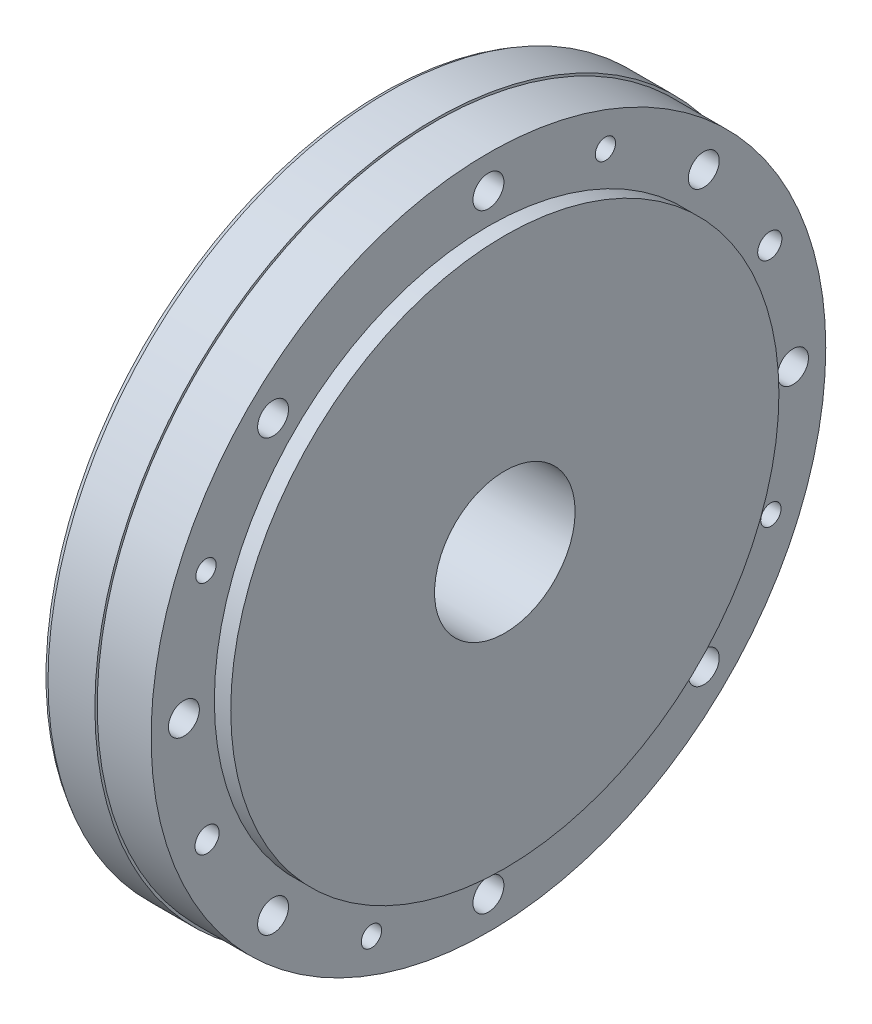
ISO-10303-21;
HEADER;
FILE_DESCRIPTION(('STEP AP214'),'2;1');
FILE_NAME('part.step','',(''),(''),'','','');
FILE_SCHEMA(('AUTOMOTIVE_DESIGN { 1 0 10303 214 1 1 1 1 }'));
ENDSEC;
DATA;
#1=APPLICATION_CONTEXT('core data for automotive mechanical design processes');
#2=APPLICATION_PROTOCOL_DEFINITION('international standard','automotive_design',2000,#1);
#3=PRODUCT_CONTEXT('',#1,'mechanical');
#4=PRODUCT('Part','Part','',(#3));
#5=PRODUCT_RELATED_PRODUCT_CATEGORY('part','',(#4));
#6=PRODUCT_DEFINITION_FORMATION('','',#4);
#7=PRODUCT_DEFINITION_CONTEXT('part definition',#1,'design');
#8=PRODUCT_DEFINITION('design','',#6,#7);
#9=PRODUCT_DEFINITION_SHAPE('','',#8);
#10=(LENGTH_UNIT() NAMED_UNIT(*) SI_UNIT(.MILLI.,.METRE.));
#11=(NAMED_UNIT(*) PLANE_ANGLE_UNIT() SI_UNIT($,.RADIAN.));
#12=(NAMED_UNIT(*) SI_UNIT($,.STERADIAN.) SOLID_ANGLE_UNIT());
#13=UNCERTAINTY_MEASURE_WITH_UNIT(LENGTH_MEASURE(1.E-05),#10,'distance_accuracy_value','');
#14=(GEOMETRIC_REPRESENTATION_CONTEXT(3) GLOBAL_UNCERTAINTY_ASSIGNED_CONTEXT((#13)) GLOBAL_UNIT_ASSIGNED_CONTEXT((#10,
#11,#12)) REPRESENTATION_CONTEXT('',''));
#15=CARTESIAN_POINT('',(0.,0.,0.));
#16=DIRECTION('',(0.,0.,1.));
#17=DIRECTION('',(1.,0.,0.));
#18=AXIS2_PLACEMENT_3D('',#15,#16,#17);
#19=CARTESIAN_POINT('',(-9.9999999998273,-15.,0.));
#20=DIRECTION('',(1.,0.,0.));
#21=DIRECTION('',(0.,0.,-1.));
#22=AXIS2_PLACEMENT_3D('',#19,#20,#21);
#23=CONICAL_SURFACE('',#22,72.4999999997008,0.523598775000002);
#24=CARTESIAN_POINT('',(-9.99999999982729,-15.,0.));
#25=DIRECTION('',(1.,0.,0.));
#26=DIRECTION('',(0.,0.,-1.));
#27=AXIS2_PLACEMENT_3D('',#24,#25,#26);
#28=CIRCLE('',#27,72.5);
#29=CARTESIAN_POINT('',(-9.99999999982729,-15.,-72.5));
#30=VERTEX_POINT('',#29);
#31=EDGE_CURVE('E31',#30,#30,#28,.T.);
#32=ORIENTED_EDGE('',*,*,#31,.F.);
#33=EDGE_LOOP('',(#32));
#34=FACE_BOUND('',#33,.T.);
#35=CARTESIAN_POINT('',(-11.0000000001727,-15.,0.));
#36=DIRECTION('',(1.,0.,0.));
#37=DIRECTION('',(0.,0.,-1.));
#38=AXIS2_PLACEMENT_3D('',#35,#36,#37);
#39=CIRCLE('',#38,71.9226497311095);
#40=CARTESIAN_POINT('',(-11.0000000001727,-15.,-71.9226497311095));
#41=VERTEX_POINT('',#40);
#42=EDGE_CURVE('E19',#41,#41,#39,.F.);
#43=ORIENTED_EDGE('',*,*,#42,.F.);
#44=EDGE_LOOP('',(#43));
#45=FACE_BOUND('',#44,.T.);
#46=ADVANCED_FACE('F16',(#34,#45),#23,.T.);
#47=CARTESIAN_POINT('',(-5.5,-15.,0.));
#48=DIRECTION('',(1.,0.,0.));
#49=DIRECTION('',(0.,0.,-1.));
#50=AXIS2_PLACEMENT_3D('',#47,#48,#49);
#51=CYLINDRICAL_SURFACE('',#50,72.5);
#52=CARTESIAN_POINT('',(0.,-15.,0.));
#53=DIRECTION('',(1.,0.,0.));
#54=DIRECTION('',(0.,0.,-1.));
#55=AXIS2_PLACEMENT_3D('',#52,#53,#54);
#56=CIRCLE('',#55,72.5);
#57=CARTESIAN_POINT('',(0.,-15.,-72.5));
#58=VERTEX_POINT('',#57);
#59=EDGE_CURVE('E133',#58,#58,#56,.T.);
#60=ORIENTED_EDGE('',*,*,#59,.F.);
#61=EDGE_LOOP('',(#60));
#62=FACE_BOUND('',#61,.T.);
#63=ORIENTED_EDGE('',*,*,#31,.T.);
#64=EDGE_LOOP('',(#63));
#65=FACE_BOUND('',#64,.T.);
#66=ADVANCED_FACE('F143',(#62,#65),#51,.T.);
#67=CARTESIAN_POINT('',(-11.,46.75,0.));
#68=DIRECTION('',(-1.,0.,0.));
#69=DIRECTION('',(0.,0.,1.));
#70=AXIS2_PLACEMENT_3D('',#67,#68,#69);
#71=PLANE('',#70);
#72=ORIENTED_EDGE('',*,*,#42,.T.);
#73=EDGE_LOOP('',(#72));
#74=FACE_BOUND('',#73,.T.);
#75=CARTESIAN_POINT('',(-11.,-39.8744231037308,60.0521696132337));
#76=DIRECTION('',(1.,0.,0.));
#77=DIRECTION('',(0.,0.,-1.));
#78=AXIS2_PLACEMENT_3D('',#75,#76,#77);
#79=CIRCLE('',#78,2.5765);
#80=CARTESIAN_POINT('',(-11.,-39.8744231037308,57.4756696132336));
#81=VERTEX_POINT('',#80);
#82=EDGE_CURVE('E89',#81,#81,#79,.T.);
#83=ORIENTED_EDGE('',*,*,#82,.T.);
#84=EDGE_LOOP('',(#83));
#85=FACE_BOUND('',#84,.T.);
#86=CARTESIAN_POINT('',(-11.,9.87442310373082,-60.0521696132337));
#87=DIRECTION('',(1.,0.,0.));
#88=DIRECTION('',(0.,0.,-1.));
#89=AXIS2_PLACEMENT_3D('',#86,#87,#88);
#90=CIRCLE('',#89,2.5765);
#91=CARTESIAN_POINT('',(-11.,9.87442310373082,-62.6286696132337));
#92=VERTEX_POINT('',#91);
#93=EDGE_CURVE('E92',#92,#92,#90,.T.);
#94=ORIENTED_EDGE('',*,*,#93,.T.);
#95=EDGE_LOOP('',(#94));
#96=FACE_BOUND('',#95,.T.);
#97=CARTESIAN_POINT('',(-11.,-15.,0.));
#98=DIRECTION('',(1.,0.,0.));
#99=DIRECTION('',(0.,0.,-1.));
#100=AXIS2_PLACEMENT_3D('',#97,#98,#99);
#101=CIRCLE('',#100,58.5);
#102=CARTESIAN_POINT('',(-11.,-15.,-58.5));
#103=VERTEX_POINT('',#102);
#104=EDGE_CURVE('E131',#103,#103,#101,.T.);
#105=ORIENTED_EDGE('',*,*,#104,.T.);
#106=EDGE_LOOP('',(#105));
#107=FACE_BOUND('',#106,.T.);
#108=CARTESIAN_POINT('',(-11.,50.,0.));
#109=DIRECTION('',(1.,0.,0.));
#110=DIRECTION('',(0.,0.,-1.));
#111=AXIS2_PLACEMENT_3D('',#108,#109,#110);
#112=CIRCLE('',#111,3.3);
#113=CARTESIAN_POINT('',(-11.,50.,-3.30000000000001));
#114=VERTEX_POINT('',#113);
#115=EDGE_CURVE('E128',#114,#114,#112,.T.);
#116=ORIENTED_EDGE('',*,*,#115,.T.);
#117=EDGE_LOOP('',(#116));
#118=FACE_BOUND('',#117,.T.);
#119=CARTESIAN_POINT('',(-11.,30.9619407771256,45.9619407771256));
#120=DIRECTION('',(1.,0.,0.));
#121=DIRECTION('',(0.,0.,-1.));
#122=AXIS2_PLACEMENT_3D('',#119,#120,#121);
#123=CIRCLE('',#122,3.3);
#124=CARTESIAN_POINT('',(-11.,30.9619407771256,42.6619407771256));
#125=VERTEX_POINT('',#124);
#126=EDGE_CURVE('E125',#125,#125,#123,.T.);
#127=ORIENTED_EDGE('',*,*,#126,.T.);
#128=EDGE_LOOP('',(#127));
#129=FACE_BOUND('',#128,.T.);
#130=CARTESIAN_POINT('',(-11.,-15.,65.));
#131=DIRECTION('',(1.,0.,0.));
#132=DIRECTION('',(0.,0.,-1.));
#133=AXIS2_PLACEMENT_3D('',#130,#131,#132);
#134=CIRCLE('',#133,3.3);
#135=CARTESIAN_POINT('',(-11.,-15.,61.7));
#136=VERTEX_POINT('',#135);
#137=EDGE_CURVE('E122',#136,#136,#134,.T.);
#138=ORIENTED_EDGE('',*,*,#137,.T.);
#139=EDGE_LOOP('',(#138));
#140=FACE_BOUND('',#139,.T.);
#141=CARTESIAN_POINT('',(-11.,-60.9619407771256,45.9619407771256));
#142=DIRECTION('',(1.,0.,0.));
#143=DIRECTION('',(0.,0.,-1.));
#144=AXIS2_PLACEMENT_3D('',#141,#142,#143);
#145=CIRCLE('',#144,3.3);
#146=CARTESIAN_POINT('',(-11.,-60.9619407771256,42.6619407771256));
#147=VERTEX_POINT('',#146);
#148=EDGE_CURVE('E119',#147,#147,#145,.T.);
#149=ORIENTED_EDGE('',*,*,#148,.T.);
#150=EDGE_LOOP('',(#149));
#151=FACE_BOUND('',#150,.T.);
#152=CARTESIAN_POINT('',(-11.,-80.,0.));
#153=DIRECTION('',(1.,0.,0.));
#154=DIRECTION('',(0.,0.,-1.));
#155=AXIS2_PLACEMENT_3D('',#152,#153,#154);
#156=CIRCLE('',#155,3.3);
#157=CARTESIAN_POINT('',(-11.,-80.,-3.29999999999998));
#158=VERTEX_POINT('',#157);
#159=EDGE_CURVE('E116',#158,#158,#156,.T.);
#160=ORIENTED_EDGE('',*,*,#159,.T.);
#161=EDGE_LOOP('',(#160));
#162=FACE_BOUND('',#161,.T.);
#163=CARTESIAN_POINT('',(-11.,-60.9619407771256,-45.9619407771256));
#164=DIRECTION('',(1.,0.,0.));
#165=DIRECTION('',(0.,0.,-1.));
#166=AXIS2_PLACEMENT_3D('',#163,#164,#165);
#167=CIRCLE('',#166,3.3);
#168=CARTESIAN_POINT('',(-11.,-60.9619407771256,-49.2619407771256));
#169=VERTEX_POINT('',#168);
#170=EDGE_CURVE('E113',#169,#169,#167,.T.);
#171=ORIENTED_EDGE('',*,*,#170,.T.);
#172=EDGE_LOOP('',(#171));
#173=FACE_BOUND('',#172,.T.);
#174=CARTESIAN_POINT('',(-11.,-15.,-65.));
#175=DIRECTION('',(1.,0.,0.));
#176=DIRECTION('',(0.,0.,-1.));
#177=AXIS2_PLACEMENT_3D('',#174,#175,#176);
#178=CIRCLE('',#177,3.3);
#179=CARTESIAN_POINT('',(-11.,-15.,-68.3));
#180=VERTEX_POINT('',#179);
#181=EDGE_CURVE('E110',#180,#180,#178,.T.);
#182=ORIENTED_EDGE('',*,*,#181,.T.);
#183=EDGE_LOOP('',(#182));
#184=FACE_BOUND('',#183,.T.);
#185=CARTESIAN_POINT('',(-11.,30.9619407771256,-45.9619407771256));
#186=DIRECTION('',(1.,0.,0.));
#187=DIRECTION('',(0.,0.,-1.));
#188=AXIS2_PLACEMENT_3D('',#185,#186,#187);
#189=CIRCLE('',#188,3.3);
#190=CARTESIAN_POINT('',(-11.,30.9619407771256,-49.2619407771256));
#191=VERTEX_POINT('',#190);
#192=EDGE_CURVE('E107',#191,#191,#189,.T.);
#193=ORIENTED_EDGE('',*,*,#192,.T.);
#194=EDGE_LOOP('',(#193));
#195=FACE_BOUND('',#194,.T.);
#196=CARTESIAN_POINT('',(-11.,45.2831394963615,-24.9700939618221));
#197=DIRECTION('',(-1.,0.,0.));
#198=DIRECTION('',(0.,0.,1.));
#199=AXIS2_PLACEMENT_3D('',#196,#197,#198);
#200=CIRCLE('',#199,2.167);
#201=CARTESIAN_POINT('',(-11.,45.2831394963615,-22.8030939618221));
#202=VERTEX_POINT('',#201);
#203=EDGE_CURVE('E104',#202,#202,#200,.F.);
#204=ORIENTED_EDGE('',*,*,#203,.T.);
#205=EDGE_LOOP('',(#204));
#206=FACE_BOUND('',#205,.T.);
#207=CARTESIAN_POINT('',(-11.,9.97009396182213,60.2831394963614));
#208=DIRECTION('',(-1.,0.,0.));
#209=DIRECTION('',(0.,0.,1.));
#210=AXIS2_PLACEMENT_3D('',#207,#208,#209);
#211=CIRCLE('',#210,2.167);
#212=CARTESIAN_POINT('',(-11.,9.97009396182213,62.4501394963615));
#213=VERTEX_POINT('',#212);
#214=EDGE_CURVE('E101',#213,#213,#211,.F.);
#215=ORIENTED_EDGE('',*,*,#214,.T.);
#216=EDGE_LOOP('',(#215));
#217=FACE_BOUND('',#216,.T.);
#218=CARTESIAN_POINT('',(-11.,-75.2831394963615,24.9700939618221));
#219=DIRECTION('',(-1.,0.,0.));
#220=DIRECTION('',(0.,0.,1.));
#221=AXIS2_PLACEMENT_3D('',#218,#219,#220);
#222=CIRCLE('',#221,2.167);
#223=CARTESIAN_POINT('',(-11.,-75.2831394963615,27.1370939618221));
#224=VERTEX_POINT('',#223);
#225=EDGE_CURVE('E98',#224,#224,#222,.F.);
#226=ORIENTED_EDGE('',*,*,#225,.T.);
#227=EDGE_LOOP('',(#226));
#228=FACE_BOUND('',#227,.T.);
#229=CARTESIAN_POINT('',(-11.,-39.9700939618221,-60.2831394963614));
#230=DIRECTION('',(-1.,0.,0.));
#231=DIRECTION('',(0.,0.,1.));
#232=AXIS2_PLACEMENT_3D('',#229,#230,#231);
#233=CIRCLE('',#232,2.167);
#234=CARTESIAN_POINT('',(-11.,-39.9700939618221,-58.1161394963614));
#235=VERTEX_POINT('',#234);
#236=EDGE_CURVE('E95',#235,#235,#233,.F.);
#237=ORIENTED_EDGE('',*,*,#236,.T.);
#238=EDGE_LOOP('',(#237));
#239=FACE_BOUND('',#238,.T.);
#240=ADVANCED_FACE('F150',(#74,#85,#96,#107,#118,#129,#140,#151,#162,#173,#184,#195,#206,#217,
#228,#239),#71,.T.);
#241=CARTESIAN_POINT('',(0.,57.25,0.));
#242=DIRECTION('',(1.,0.,0.));
#243=DIRECTION('',(0.,0.,-1.));
#244=AXIS2_PLACEMENT_3D('',#241,#242,#243);
#245=PLANE('',#244);
#246=ORIENTED_EDGE('',*,*,#59,.T.);
#247=EDGE_LOOP('',(#246));
#248=FACE_BOUND('',#247,.T.);
#249=CARTESIAN_POINT('',(0.,-15.,0.));
#250=DIRECTION('',(1.,0.,0.));
#251=DIRECTION('',(0.,0.,-1.));
#252=AXIS2_PLACEMENT_3D('',#249,#250,#251);
#253=CIRCLE('',#252,72.);
#254=CARTESIAN_POINT('',(0.,-15.,-72.));
#255=VERTEX_POINT('',#254);
#256=EDGE_CURVE('E86',#255,#255,#253,.T.);
#257=ORIENTED_EDGE('',*,*,#256,.F.);
#258=EDGE_LOOP('',(#257));
#259=FACE_BOUND('',#258,.T.);
#260=ADVANCED_FACE('F238',(#248,#259),#245,.T.);
#261=CARTESIAN_POINT('',(-9.5,-15.,0.));
#262=DIRECTION('',(1.,0.,0.));
#263=DIRECTION('',(0.,0.,-1.));
#264=AXIS2_PLACEMENT_3D('',#261,#262,#263);
#265=CYLINDRICAL_SURFACE('',#264,58.5);
#266=ORIENTED_EDGE('',*,*,#104,.F.);
#267=EDGE_LOOP('',(#266));
#268=FACE_BOUND('',#267,.T.);
#269=CARTESIAN_POINT('',(-8.,-15.,0.));
#270=DIRECTION('',(1.,0.,0.));
#271=DIRECTION('',(0.,0.,-1.));
#272=AXIS2_PLACEMENT_3D('',#269,#270,#271);
#273=CIRCLE('',#272,58.5);
#274=CARTESIAN_POINT('',(-8.,-15.,-58.5));
#275=VERTEX_POINT('',#274);
#276=EDGE_CURVE('E83',#275,#275,#273,.F.);
#277=ORIENTED_EDGE('',*,*,#276,.F.);
#278=EDGE_LOOP('',(#277));
#279=FACE_BOUND('',#278,.T.);
#280=ADVANCED_FACE('F234',(#268,#279),#265,.F.);
#281=CARTESIAN_POINT('',(195.702685033359,50.,0.));
#282=DIRECTION('',(1.,0.,0.));
#283=DIRECTION('',(0.,0.,-1.));
#284=AXIS2_PLACEMENT_3D('',#281,#282,#283);
#285=CYLINDRICAL_SURFACE('',#284,3.3);
#286=ORIENTED_EDGE('',*,*,#115,.F.);
#287=EDGE_LOOP('',(#286));
#288=FACE_BOUND('',#287,.T.);
#289=CARTESIAN_POINT('',(11.5,50.,0.));
#290=DIRECTION('',(1.,0.,0.));
#291=DIRECTION('',(0.,0.,-1.));
#292=AXIS2_PLACEMENT_3D('',#289,#290,#291);
#293=CIRCLE('',#292,3.3);
#294=CARTESIAN_POINT('',(11.5,50.,-3.30000000000001));
#295=VERTEX_POINT('',#294);
#296=EDGE_CURVE('E80',#295,#295,#293,.F.);
#297=ORIENTED_EDGE('',*,*,#296,.F.);
#298=EDGE_LOOP('',(#297));
#299=FACE_BOUND('',#298,.T.);
#300=ADVANCED_FACE('F230',(#288,#299),#285,.F.);
#301=CARTESIAN_POINT('',(195.702685033359,30.9619407771256,45.9619407771256));
#302=DIRECTION('',(1.,0.,0.));
#303=DIRECTION('',(0.,0.,-1.));
#304=AXIS2_PLACEMENT_3D('',#301,#302,#303);
#305=CYLINDRICAL_SURFACE('',#304,3.3);
#306=ORIENTED_EDGE('',*,*,#126,.F.);
#307=EDGE_LOOP('',(#306));
#308=FACE_BOUND('',#307,.T.);
#309=CARTESIAN_POINT('',(11.5,30.9619407771256,45.9619407771256));
#310=DIRECTION('',(1.,0.,0.));
#311=DIRECTION('',(0.,0.,-1.));
#312=AXIS2_PLACEMENT_3D('',#309,#310,#311);
#313=CIRCLE('',#312,3.3);
#314=CARTESIAN_POINT('',(11.5,30.9619407771256,42.6619407771256));
#315=VERTEX_POINT('',#314);
#316=EDGE_CURVE('E77',#315,#315,#313,.F.);
#317=ORIENTED_EDGE('',*,*,#316,.F.);
#318=EDGE_LOOP('',(#317));
#319=FACE_BOUND('',#318,.T.);
#320=ADVANCED_FACE('F226',(#308,#319),#305,.F.);
#321=CARTESIAN_POINT('',(195.702685033359,-15.,65.));
#322=DIRECTION('',(1.,0.,0.));
#323=DIRECTION('',(0.,0.,-1.));
#324=AXIS2_PLACEMENT_3D('',#321,#322,#323);
#325=CYLINDRICAL_SURFACE('',#324,3.3);
#326=ORIENTED_EDGE('',*,*,#137,.F.);
#327=EDGE_LOOP('',(#326));
#328=FACE_BOUND('',#327,.T.);
#329=CARTESIAN_POINT('',(11.5,-15.,65.));
#330=DIRECTION('',(1.,0.,0.));
#331=DIRECTION('',(0.,0.,-1.));
#332=AXIS2_PLACEMENT_3D('',#329,#330,#331);
#333=CIRCLE('',#332,3.3);
#334=CARTESIAN_POINT('',(11.5,-15.,61.7));
#335=VERTEX_POINT('',#334);
#336=EDGE_CURVE('E74',#335,#335,#333,.F.);
#337=ORIENTED_EDGE('',*,*,#336,.F.);
#338=EDGE_LOOP('',(#337));
#339=FACE_BOUND('',#338,.T.);
#340=ADVANCED_FACE('F222',(#328,#339),#325,.F.);
#341=CARTESIAN_POINT('',(195.702685033359,-60.9619407771256,45.9619407771256));
#342=DIRECTION('',(1.,0.,0.));
#343=DIRECTION('',(0.,0.,-1.));
#344=AXIS2_PLACEMENT_3D('',#341,#342,#343);
#345=CYLINDRICAL_SURFACE('',#344,3.3);
#346=ORIENTED_EDGE('',*,*,#148,.F.);
#347=EDGE_LOOP('',(#346));
#348=FACE_BOUND('',#347,.T.);
#349=CARTESIAN_POINT('',(11.5,-60.9619407771256,45.9619407771256));
#350=DIRECTION('',(1.,0.,0.));
#351=DIRECTION('',(0.,0.,-1.));
#352=AXIS2_PLACEMENT_3D('',#349,#350,#351);
#353=CIRCLE('',#352,3.3);
#354=CARTESIAN_POINT('',(11.5,-60.9619407771256,42.6619407771256));
#355=VERTEX_POINT('',#354);
#356=EDGE_CURVE('E71',#355,#355,#353,.F.);
#357=ORIENTED_EDGE('',*,*,#356,.F.);
#358=EDGE_LOOP('',(#357));
#359=FACE_BOUND('',#358,.T.);
#360=ADVANCED_FACE('F218',(#348,#359),#345,.F.);
#361=CARTESIAN_POINT('',(195.702685033359,-80.,0.));
#362=DIRECTION('',(1.,0.,0.));
#363=DIRECTION('',(0.,0.,-1.));
#364=AXIS2_PLACEMENT_3D('',#361,#362,#363);
#365=CYLINDRICAL_SURFACE('',#364,3.3);
#366=ORIENTED_EDGE('',*,*,#159,.F.);
#367=EDGE_LOOP('',(#366));
#368=FACE_BOUND('',#367,.T.);
#369=CARTESIAN_POINT('',(11.5,-80.,0.));
#370=DIRECTION('',(1.,0.,0.));
#371=DIRECTION('',(0.,0.,-1.));
#372=AXIS2_PLACEMENT_3D('',#369,#370,#371);
#373=CIRCLE('',#372,3.3);
#374=CARTESIAN_POINT('',(11.5,-80.,-3.29999999999998));
#375=VERTEX_POINT('',#374);
#376=EDGE_CURVE('E68',#375,#375,#373,.F.);
#377=ORIENTED_EDGE('',*,*,#376,.F.);
#378=EDGE_LOOP('',(#377));
#379=FACE_BOUND('',#378,.T.);
#380=ADVANCED_FACE('F214',(#368,#379),#365,.F.);
#381=CARTESIAN_POINT('',(195.702685033359,-60.9619407771256,-45.9619407771256));
#382=DIRECTION('',(1.,0.,0.));
#383=DIRECTION('',(0.,0.,-1.));
#384=AXIS2_PLACEMENT_3D('',#381,#382,#383);
#385=CYLINDRICAL_SURFACE('',#384,3.3);
#386=ORIENTED_EDGE('',*,*,#170,.F.);
#387=EDGE_LOOP('',(#386));
#388=FACE_BOUND('',#387,.T.);
#389=CARTESIAN_POINT('',(11.5,-60.9619407771256,-45.9619407771256));
#390=DIRECTION('',(1.,0.,0.));
#391=DIRECTION('',(0.,0.,-1.));
#392=AXIS2_PLACEMENT_3D('',#389,#390,#391);
#393=CIRCLE('',#392,3.3);
#394=CARTESIAN_POINT('',(11.5,-60.9619407771256,-49.2619407771256));
#395=VERTEX_POINT('',#394);
#396=EDGE_CURVE('E65',#395,#395,#393,.F.);
#397=ORIENTED_EDGE('',*,*,#396,.F.);
#398=EDGE_LOOP('',(#397));
#399=FACE_BOUND('',#398,.T.);
#400=ADVANCED_FACE('F210',(#388,#399),#385,.F.);
#401=CARTESIAN_POINT('',(195.702685033359,-15.,-65.));
#402=DIRECTION('',(1.,0.,0.));
#403=DIRECTION('',(0.,0.,-1.));
#404=AXIS2_PLACEMENT_3D('',#401,#402,#403);
#405=CYLINDRICAL_SURFACE('',#404,3.3);
#406=ORIENTED_EDGE('',*,*,#181,.F.);
#407=EDGE_LOOP('',(#406));
#408=FACE_BOUND('',#407,.T.);
#409=CARTESIAN_POINT('',(11.5,-15.,-65.));
#410=DIRECTION('',(1.,0.,0.));
#411=DIRECTION('',(0.,0.,-1.));
#412=AXIS2_PLACEMENT_3D('',#409,#410,#411);
#413=CIRCLE('',#412,3.3);
#414=CARTESIAN_POINT('',(11.5,-15.,-68.3));
#415=VERTEX_POINT('',#414);
#416=EDGE_CURVE('E62',#415,#415,#413,.F.);
#417=ORIENTED_EDGE('',*,*,#416,.F.);
#418=EDGE_LOOP('',(#417));
#419=FACE_BOUND('',#418,.T.);
#420=ADVANCED_FACE('F206',(#408,#419),#405,.F.);
#421=CARTESIAN_POINT('',(195.702685033359,30.9619407771256,-45.9619407771256));
#422=DIRECTION('',(1.,0.,0.));
#423=DIRECTION('',(0.,0.,-1.));
#424=AXIS2_PLACEMENT_3D('',#421,#422,#423);
#425=CYLINDRICAL_SURFACE('',#424,3.3);
#426=ORIENTED_EDGE('',*,*,#192,.F.);
#427=EDGE_LOOP('',(#426));
#428=FACE_BOUND('',#427,.T.);
#429=CARTESIAN_POINT('',(11.5,30.9619407771256,-45.9619407771256));
#430=DIRECTION('',(1.,0.,0.));
#431=DIRECTION('',(0.,0.,-1.));
#432=AXIS2_PLACEMENT_3D('',#429,#430,#431);
#433=CIRCLE('',#432,3.3);
#434=CARTESIAN_POINT('',(11.5,30.9619407771256,-49.2619407771256));
#435=VERTEX_POINT('',#434);
#436=EDGE_CURVE('E59',#435,#435,#433,.F.);
#437=ORIENTED_EDGE('',*,*,#436,.F.);
#438=EDGE_LOOP('',(#437));
#439=FACE_BOUND('',#438,.T.);
#440=ADVANCED_FACE('F202',(#428,#439),#425,.F.);
#441=CARTESIAN_POINT('',(-195.202685033359,45.2831394963615,-24.9700939618221));
#442=DIRECTION('',(-1.,0.,0.));
#443=DIRECTION('',(0.,0.,1.));
#444=AXIS2_PLACEMENT_3D('',#441,#442,#443);
#445=CYLINDRICAL_SURFACE('',#444,2.167);
#446=ORIENTED_EDGE('',*,*,#203,.F.);
#447=EDGE_LOOP('',(#446));
#448=FACE_BOUND('',#447,.T.);
#449=CARTESIAN_POINT('',(11.5,45.2831394963615,-24.9700939618221));
#450=DIRECTION('',(-1.,0.,0.));
#451=DIRECTION('',(0.,0.,1.));
#452=AXIS2_PLACEMENT_3D('',#449,#450,#451);
#453=CIRCLE('',#452,2.167);
#454=CARTESIAN_POINT('',(11.5,45.2831394963615,-22.8030939618221));
#455=VERTEX_POINT('',#454);
#456=EDGE_CURVE('E56',#455,#455,#453,.T.);
#457=ORIENTED_EDGE('',*,*,#456,.F.);
#458=EDGE_LOOP('',(#457));
#459=FACE_BOUND('',#458,.T.);
#460=ADVANCED_FACE('F198',(#448,#459),#445,.F.);
#461=CARTESIAN_POINT('',(-195.202685033359,9.97009396182213,60.2831394963614));
#462=DIRECTION('',(-1.,0.,0.));
#463=DIRECTION('',(0.,0.,1.));
#464=AXIS2_PLACEMENT_3D('',#461,#462,#463);
#465=CYLINDRICAL_SURFACE('',#464,2.167);
#466=ORIENTED_EDGE('',*,*,#214,.F.);
#467=EDGE_LOOP('',(#466));
#468=FACE_BOUND('',#467,.T.);
#469=CARTESIAN_POINT('',(11.5,9.97009396182213,60.2831394963614));
#470=DIRECTION('',(-1.,0.,0.));
#471=DIRECTION('',(0.,0.,1.));
#472=AXIS2_PLACEMENT_3D('',#469,#470,#471);
#473=CIRCLE('',#472,2.167);
#474=CARTESIAN_POINT('',(11.5,9.97009396182213,62.4501394963615));
#475=VERTEX_POINT('',#474);
#476=EDGE_CURVE('E53',#475,#475,#473,.T.);
#477=ORIENTED_EDGE('',*,*,#476,.F.);
#478=EDGE_LOOP('',(#477));
#479=FACE_BOUND('',#478,.T.);
#480=ADVANCED_FACE('F194',(#468,#479),#465,.F.);
#481=CARTESIAN_POINT('',(-195.202685033359,-75.2831394963615,24.9700939618221));
#482=DIRECTION('',(-1.,0.,0.));
#483=DIRECTION('',(0.,0.,1.));
#484=AXIS2_PLACEMENT_3D('',#481,#482,#483);
#485=CYLINDRICAL_SURFACE('',#484,2.167);
#486=ORIENTED_EDGE('',*,*,#225,.F.);
#487=EDGE_LOOP('',(#486));
#488=FACE_BOUND('',#487,.T.);
#489=CARTESIAN_POINT('',(11.5,-75.2831394963615,24.9700939618221));
#490=DIRECTION('',(-1.,0.,0.));
#491=DIRECTION('',(0.,0.,1.));
#492=AXIS2_PLACEMENT_3D('',#489,#490,#491);
#493=CIRCLE('',#492,2.167);
#494=CARTESIAN_POINT('',(11.5,-75.2831394963615,27.1370939618221));
#495=VERTEX_POINT('',#494);
#496=EDGE_CURVE('E50',#495,#495,#493,.T.);
#497=ORIENTED_EDGE('',*,*,#496,.F.);
#498=EDGE_LOOP('',(#497));
#499=FACE_BOUND('',#498,.T.);
#500=ADVANCED_FACE('F190',(#488,#499),#485,.F.);
#501=CARTESIAN_POINT('',(-195.202685033359,-39.9700939618221,-60.2831394963614));
#502=DIRECTION('',(-1.,0.,0.));
#503=DIRECTION('',(0.,0.,1.));
#504=AXIS2_PLACEMENT_3D('',#501,#502,#503);
#505=CYLINDRICAL_SURFACE('',#504,2.167);
#506=ORIENTED_EDGE('',*,*,#236,.F.);
#507=EDGE_LOOP('',(#506));
#508=FACE_BOUND('',#507,.T.);
#509=CARTESIAN_POINT('',(11.5,-39.9700939618221,-60.2831394963614));
#510=DIRECTION('',(-1.,0.,0.));
#511=DIRECTION('',(0.,0.,1.));
#512=AXIS2_PLACEMENT_3D('',#509,#510,#511);
#513=CIRCLE('',#512,2.167);
#514=CARTESIAN_POINT('',(11.5,-39.9700939618221,-58.1161394963614));
#515=VERTEX_POINT('',#514);
#516=EDGE_CURVE('E47',#515,#515,#513,.T.);
#517=ORIENTED_EDGE('',*,*,#516,.F.);
#518=EDGE_LOOP('',(#517));
#519=FACE_BOUND('',#518,.T.);
#520=ADVANCED_FACE('F186',(#508,#519),#505,.F.);
#521=CARTESIAN_POINT('',(195.702685033359,9.87442310373082,-60.0521696132337));
#522=DIRECTION('',(1.,0.,0.));
#523=DIRECTION('',(0.,0.,-1.));
#524=AXIS2_PLACEMENT_3D('',#521,#522,#523);
#525=CYLINDRICAL_SURFACE('',#524,2.5765);
#526=ORIENTED_EDGE('',*,*,#93,.F.);
#527=EDGE_LOOP('',(#526));
#528=FACE_BOUND('',#527,.T.);
#529=CARTESIAN_POINT('',(11.5,9.87442310373082,-60.0521696132337));
#530=DIRECTION('',(1.,0.,0.));
#531=DIRECTION('',(0.,0.,-1.));
#532=AXIS2_PLACEMENT_3D('',#529,#530,#531);
#533=CIRCLE('',#532,2.5765);
#534=CARTESIAN_POINT('',(11.5,9.87442310373082,-62.6286696132337));
#535=VERTEX_POINT('',#534);
#536=EDGE_CURVE('E44',#535,#535,#533,.F.);
#537=ORIENTED_EDGE('',*,*,#536,.F.);
#538=EDGE_LOOP('',(#537));
#539=FACE_BOUND('',#538,.T.);
#540=ADVANCED_FACE('F182',(#528,#539),#525,.F.);
#541=CARTESIAN_POINT('',(195.702685033359,-39.8744231037308,60.0521696132337));
#542=DIRECTION('',(1.,0.,0.));
#543=DIRECTION('',(0.,0.,-1.));
#544=AXIS2_PLACEMENT_3D('',#541,#542,#543);
#545=CYLINDRICAL_SURFACE('',#544,2.5765);
#546=ORIENTED_EDGE('',*,*,#82,.F.);
#547=EDGE_LOOP('',(#546));
#548=FACE_BOUND('',#547,.T.);
#549=CARTESIAN_POINT('',(11.5,-39.8744231037308,60.0521696132337));
#550=DIRECTION('',(1.,0.,0.));
#551=DIRECTION('',(0.,0.,-1.));
#552=AXIS2_PLACEMENT_3D('',#549,#550,#551);
#553=CIRCLE('',#552,2.5765);
#554=CARTESIAN_POINT('',(11.5,-39.8744231037308,57.4756696132336));
#555=VERTEX_POINT('',#554);
#556=EDGE_CURVE('E41',#555,#555,#553,.F.);
#557=ORIENTED_EDGE('',*,*,#556,.F.);
#558=EDGE_LOOP('',(#557));
#559=FACE_BOUND('',#558,.T.);
#560=ADVANCED_FACE('F178',(#548,#559),#545,.F.);
#561=CARTESIAN_POINT('',(5.75,-15.,0.));
#562=DIRECTION('',(1.,0.,0.));
#563=DIRECTION('',(0.,0.,-1.));
#564=AXIS2_PLACEMENT_3D('',#561,#562,#563);
#565=CYLINDRICAL_SURFACE('',#564,72.);
#566=ORIENTED_EDGE('',*,*,#256,.T.);
#567=EDGE_LOOP('',(#566));
#568=FACE_BOUND('',#567,.T.);
#569=CARTESIAN_POINT('',(11.5,-15.,0.));
#570=DIRECTION('',(1.,0.,0.));
#571=DIRECTION('',(0.,0.,-1.));
#572=AXIS2_PLACEMENT_3D('',#569,#570,#571);
#573=CIRCLE('',#572,72.);
#574=CARTESIAN_POINT('',(11.5,-15.,-72.));
#575=VERTEX_POINT('',#574);
#576=EDGE_CURVE('E38',#575,#575,#573,.T.);
#577=ORIENTED_EDGE('',*,*,#576,.F.);
#578=EDGE_LOOP('',(#577));
#579=FACE_BOUND('',#578,.T.);
#580=ADVANCED_FACE('F174',(#568,#579),#565,.T.);
#581=CARTESIAN_POINT('',(-8.,18.,0.));
#582=DIRECTION('',(-1.,0.,0.));
#583=DIRECTION('',(0.,0.,1.));
#584=AXIS2_PLACEMENT_3D('',#581,#582,#583);
#585=PLANE('',#584);
#586=ORIENTED_EDGE('',*,*,#276,.T.);
#587=EDGE_LOOP('',(#586));
#588=FACE_BOUND('',#587,.T.);
#589=CARTESIAN_POINT('',(-8.,-15.,0.));
#590=DIRECTION('',(1.,0.,0.));
#591=DIRECTION('',(0.,0.,-1.));
#592=AXIS2_PLACEMENT_3D('',#589,#590,#591);
#593=CIRCLE('',#592,15.);
#594=CARTESIAN_POINT('',(-8.,-15.,-15.));
#595=VERTEX_POINT('',#594);
#596=EDGE_CURVE('E35',#595,#595,#593,.T.);
#597=ORIENTED_EDGE('',*,*,#596,.T.);
#598=EDGE_LOOP('',(#597));
#599=FACE_BOUND('',#598,.T.);
#600=ADVANCED_FACE('F170',(#588,#599),#585,.T.);
#601=CARTESIAN_POINT('',(11.5,51.,0.));
#602=DIRECTION('',(1.,0.,0.));
#603=DIRECTION('',(0.,0.,-1.));
#604=AXIS2_PLACEMENT_3D('',#601,#602,#603);
#605=PLANE('',#604);
#606=ORIENTED_EDGE('',*,*,#576,.T.);
#607=EDGE_LOOP('',(#606));
#608=FACE_BOUND('',#607,.T.);
#609=ORIENTED_EDGE('',*,*,#556,.T.);
#610=EDGE_LOOP('',(#609));
#611=FACE_BOUND('',#610,.T.);
#612=ORIENTED_EDGE('',*,*,#536,.T.);
#613=EDGE_LOOP('',(#612));
#614=FACE_BOUND('',#613,.T.);
#615=ORIENTED_EDGE('',*,*,#516,.T.);
#616=EDGE_LOOP('',(#615));
#617=FACE_BOUND('',#616,.T.);
#618=ORIENTED_EDGE('',*,*,#496,.T.);
#619=EDGE_LOOP('',(#618));
#620=FACE_BOUND('',#619,.T.);
#621=ORIENTED_EDGE('',*,*,#476,.T.);
#622=EDGE_LOOP('',(#621));
#623=FACE_BOUND('',#622,.T.);
#624=ORIENTED_EDGE('',*,*,#456,.T.);
#625=EDGE_LOOP('',(#624));
#626=FACE_BOUND('',#625,.T.);
#627=ORIENTED_EDGE('',*,*,#436,.T.);
#628=EDGE_LOOP('',(#627));
#629=FACE_BOUND('',#628,.T.);
#630=ORIENTED_EDGE('',*,*,#416,.T.);
#631=EDGE_LOOP('',(#630));
#632=FACE_BOUND('',#631,.T.);
#633=ORIENTED_EDGE('',*,*,#396,.T.);
#634=EDGE_LOOP('',(#633));
#635=FACE_BOUND('',#634,.T.);
#636=ORIENTED_EDGE('',*,*,#376,.T.);
#637=EDGE_LOOP('',(#636));
#638=FACE_BOUND('',#637,.T.);
#639=ORIENTED_EDGE('',*,*,#356,.T.);
#640=EDGE_LOOP('',(#639));
#641=FACE_BOUND('',#640,.T.);
#642=ORIENTED_EDGE('',*,*,#336,.T.);
#643=EDGE_LOOP('',(#642));
#644=FACE_BOUND('',#643,.T.);
#645=ORIENTED_EDGE('',*,*,#316,.T.);
#646=EDGE_LOOP('',(#645));
#647=FACE_BOUND('',#646,.T.);
#648=ORIENTED_EDGE('',*,*,#296,.T.);
#649=EDGE_LOOP('',(#648));
#650=FACE_BOUND('',#649,.T.);
#651=CARTESIAN_POINT('',(11.5,-15.,0.));
#652=DIRECTION('',(1.,0.,0.));
#653=DIRECTION('',(0.,0.,-1.));
#654=AXIS2_PLACEMENT_3D('',#651,#652,#653);
#655=CIRCLE('',#654,58.5);
#656=CARTESIAN_POINT('',(11.5,-15.,-58.5));
#657=VERTEX_POINT('',#656);
#658=EDGE_CURVE('E28',#657,#657,#655,.T.);
#659=ORIENTED_EDGE('',*,*,#658,.F.);
#660=EDGE_LOOP('',(#659));
#661=FACE_BOUND('',#660,.T.);
#662=ADVANCED_FACE('F166',(#608,#611,#614,#617,#620,#623,#626,#629,#632,#635,#638,#641,#644,
#647,#650,#661),#605,.T.);
#663=CARTESIAN_POINT('',(-8.,-15.,0.));
#664=DIRECTION('',(1.,0.,0.));
#665=DIRECTION('',(0.,0.,-1.));
#666=AXIS2_PLACEMENT_3D('',#663,#664,#665);
#667=CYLINDRICAL_SURFACE('',#666,15.);
#668=ORIENTED_EDGE('',*,*,#596,.F.);
#669=EDGE_LOOP('',(#668));
#670=FACE_BOUND('',#669,.T.);
#671=CARTESIAN_POINT('',(15.,-15.,0.));
#672=DIRECTION('',(1.,0.,0.));
#673=DIRECTION('',(0.,0.,-1.));
#674=AXIS2_PLACEMENT_3D('',#671,#672,#673);
#675=CIRCLE('',#674,15.);
#676=CARTESIAN_POINT('',(15.,-15.,-15.));
#677=VERTEX_POINT('',#676);
#678=EDGE_CURVE('E23',#677,#677,#675,.F.);
#679=ORIENTED_EDGE('',*,*,#678,.F.);
#680=EDGE_LOOP('',(#679));
#681=FACE_BOUND('',#680,.T.);
#682=ADVANCED_FACE('F159',(#670,#681),#667,.F.);
#683=CARTESIAN_POINT('',(13.25,-15.,0.));
#684=DIRECTION('',(1.,0.,0.));
#685=DIRECTION('',(0.,0.,-1.));
#686=AXIS2_PLACEMENT_3D('',#683,#684,#685);
#687=CYLINDRICAL_SURFACE('',#686,58.5);
#688=ORIENTED_EDGE('',*,*,#658,.T.);
#689=EDGE_LOOP('',(#688));
#690=FACE_BOUND('',#689,.T.);
#691=CARTESIAN_POINT('',(15.,-15.,0.));
#692=DIRECTION('',(1.,0.,0.));
#693=DIRECTION('',(0.,0.,-1.));
#694=AXIS2_PLACEMENT_3D('',#691,#692,#693);
#695=CIRCLE('',#694,58.5);
#696=CARTESIAN_POINT('',(15.,-15.,-58.5));
#697=VERTEX_POINT('',#696);
#698=EDGE_CURVE('E10',#697,#697,#695,.T.);
#699=ORIENTED_EDGE('',*,*,#698,.F.);
#700=EDGE_LOOP('',(#699));
#701=FACE_BOUND('',#700,.T.);
#702=ADVANCED_FACE('F154',(#690,#701),#687,.T.);
#703=CARTESIAN_POINT('',(15.,14.25,0.));
#704=DIRECTION('',(1.,0.,0.));
#705=DIRECTION('',(0.,0.,-1.));
#706=AXIS2_PLACEMENT_3D('',#703,#704,#705);
#707=PLANE('',#706);
#708=ORIENTED_EDGE('',*,*,#698,.T.);
#709=EDGE_LOOP('',(#708));
#710=FACE_BOUND('',#709,.T.);
#711=ORIENTED_EDGE('',*,*,#678,.T.);
#712=EDGE_LOOP('',(#711));
#713=FACE_BOUND('',#712,.T.);
#714=ADVANCED_FACE('F152',(#710,#713),#707,.T.);
#715=CLOSED_SHELL('',(#46,#66,#240,#260,#280,#300,#320,#340,#360,#380,#400,#420,#440,#460,#480,
#500,#520,#540,#560,#580,#600,#662,#682,#702,#714));
#716=MANIFOLD_SOLID_BREP('B1',#715);
#717=ADVANCED_BREP_SHAPE_REPRESENTATION('',(#18,#716),#14);
#718=SHAPE_DEFINITION_REPRESENTATION(#9,#717);
ENDSEC;
END-ISO-10303-21;
